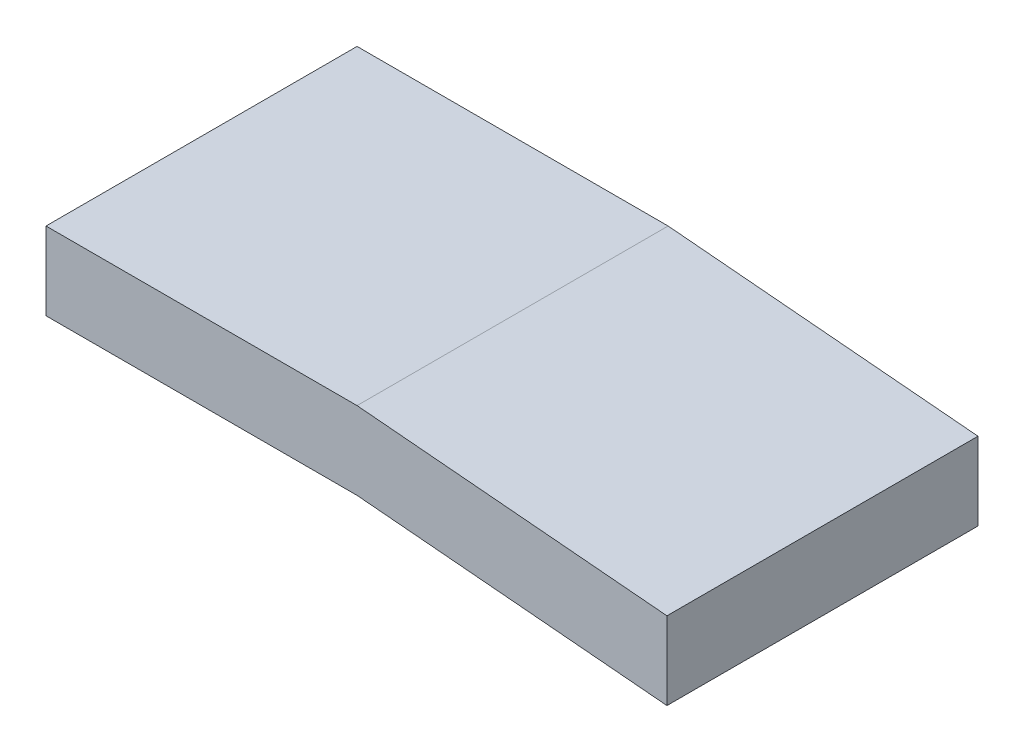
ISO-10303-21;
HEADER;
FILE_DESCRIPTION(('STEP AP214'),'2;1');
FILE_NAME('part.step','',(''),(''),'','','');
FILE_SCHEMA(('AUTOMOTIVE_DESIGN { 1 0 10303 214 1 1 1 1 }'));
ENDSEC;
DATA;
#1=APPLICATION_CONTEXT('core data for automotive mechanical design processes');
#2=APPLICATION_PROTOCOL_DEFINITION('international standard','automotive_design',2000,#1);
#3=PRODUCT_CONTEXT('',#1,'mechanical');
#4=PRODUCT('Part','Part','',(#3));
#5=PRODUCT_RELATED_PRODUCT_CATEGORY('part','',(#4));
#6=PRODUCT_DEFINITION_FORMATION('','',#4);
#7=PRODUCT_DEFINITION_CONTEXT('part definition',#1,'design');
#8=PRODUCT_DEFINITION('design','',#6,#7);
#9=PRODUCT_DEFINITION_SHAPE('','',#8);
#10=(LENGTH_UNIT() NAMED_UNIT(*) SI_UNIT(.MILLI.,.METRE.));
#11=(NAMED_UNIT(*) PLANE_ANGLE_UNIT() SI_UNIT($,.RADIAN.));
#12=(NAMED_UNIT(*) SI_UNIT($,.STERADIAN.) SOLID_ANGLE_UNIT());
#13=UNCERTAINTY_MEASURE_WITH_UNIT(LENGTH_MEASURE(1.E-05),#10,'distance_accuracy_value','');
#14=(GEOMETRIC_REPRESENTATION_CONTEXT(3) GLOBAL_UNCERTAINTY_ASSIGNED_CONTEXT((#13)) GLOBAL_UNIT_ASSIGNED_CONTEXT((#10,
#11,#12)) REPRESENTATION_CONTEXT('',''));
#15=CARTESIAN_POINT('',(0.,0.,0.));
#16=DIRECTION('',(0.,0.,1.));
#17=DIRECTION('',(1.,0.,0.));
#18=AXIS2_PLACEMENT_3D('',#15,#16,#17);
#19=CARTESIAN_POINT('',(50.8,0.,50.8));
#20=DIRECTION('',(0.,1.,0.));
#21=DIRECTION('',(-1.,0.,0.));
#22=AXIS2_PLACEMENT_3D('',#19,#20,#21);
#23=PLANE('',#22);
#24=DIRECTION('',(1.,0.,0.));
#25=VECTOR('',#24,1.);
#26=CARTESIAN_POINT('',(50.8,0.,0.));
#27=LINE('',#26,#25);
#28=CARTESIAN_POINT('',(0.,0.,0.));
#29=VERTEX_POINT('',#28);
#30=CARTESIAN_POINT('',(50.8,0.,0.));
#31=VERTEX_POINT('',#30);
#32=EDGE_CURVE('E120',#29,#31,#27,.T.);
#33=ORIENTED_EDGE('',*,*,#32,.T.);
#34=DIRECTION('',(0.,0.,-1.));
#35=VECTOR('',#34,1.);
#36=CARTESIAN_POINT('',(50.8,0.,50.8));
#37=LINE('',#36,#35);
#38=CARTESIAN_POINT('',(50.8,0.,50.8));
#39=VERTEX_POINT('',#38);
#40=EDGE_CURVE('E11',#39,#31,#37,.T.);
#41=ORIENTED_EDGE('',*,*,#40,.F.);
#42=DIRECTION('',(1.,0.,0.));
#43=VECTOR('',#42,1.);
#44=CARTESIAN_POINT('',(50.8,0.,50.8));
#45=LINE('',#44,#43);
#46=CARTESIAN_POINT('',(0.,0.,50.8));
#47=VERTEX_POINT('',#46);
#48=EDGE_CURVE('E130',#47,#39,#45,.T.);
#49=ORIENTED_EDGE('',*,*,#48,.F.);
#50=DIRECTION('',(0.,0.,-1.));
#51=VECTOR('',#50,1.);
#52=CARTESIAN_POINT('',(0.,0.,50.8));
#53=LINE('',#52,#51);
#54=EDGE_CURVE('E116',#47,#29,#53,.T.);
#55=ORIENTED_EDGE('',*,*,#54,.T.);
#56=EDGE_LOOP('',(#33,#41,#49,#55));
#57=FACE_BOUND('',#56,.T.);
#58=ADVANCED_FACE('F36',(#57),#23,.F.);
#59=CARTESIAN_POINT('',(101.406690663061,-4.42751173158105,50.8));
#60=DIRECTION('',(0.0871557427476582,0.996194698091746,0.));
#61=DIRECTION('',(-0.996194698091746,0.0871557427476582,0.));
#62=AXIS2_PLACEMENT_3D('',#59,#60,#61);
#63=PLANE('',#62);
#64=DIRECTION('',(0.996194698091746,-0.0871557427476582,0.));
#65=VECTOR('',#64,1.);
#66=CARTESIAN_POINT('',(101.406690663061,-4.42751173158105,0.));
#67=LINE('',#66,#65);
#68=CARTESIAN_POINT('',(101.406690663061,-4.42751173158105,0.));
#69=VERTEX_POINT('',#68);
#70=EDGE_CURVE('E123',#31,#69,#67,.T.);
#71=ORIENTED_EDGE('',*,*,#70,.T.);
#72=DIRECTION('',(0.,0.,-1.));
#73=VECTOR('',#72,1.);
#74=CARTESIAN_POINT('',(101.406690663061,-4.42751173158105,50.8));
#75=LINE('',#74,#73);
#76=CARTESIAN_POINT('',(101.406690663061,-4.42751173158105,50.8));
#77=VERTEX_POINT('',#76);
#78=EDGE_CURVE('E44',#77,#69,#75,.T.);
#79=ORIENTED_EDGE('',*,*,#78,.F.);
#80=DIRECTION('',(0.996194698091746,-0.0871557427476582,0.));
#81=VECTOR('',#80,1.);
#82=CARTESIAN_POINT('',(101.406690663061,-4.42751173158105,50.8));
#83=LINE('',#82,#81);
#84=EDGE_CURVE('E89',#39,#77,#83,.T.);
#85=ORIENTED_EDGE('',*,*,#84,.F.);
#86=ORIENTED_EDGE('',*,*,#40,.T.);
#87=EDGE_LOOP('',(#71,#79,#85,#86));
#88=FACE_BOUND('',#87,.T.);
#89=ADVANCED_FACE('F154',(#88),#63,.F.);
#90=CARTESIAN_POINT('',(101.406690663061,8.27248826841894,50.8));
#91=DIRECTION('',(-1.,0.,0.));
#92=DIRECTION('',(0.,-1.,0.));
#93=AXIS2_PLACEMENT_3D('',#90,#91,#92);
#94=PLANE('',#93);
#95=DIRECTION('',(0.,1.,0.));
#96=VECTOR('',#95,1.);
#97=CARTESIAN_POINT('',(101.406690663061,8.27248826841894,0.));
#98=LINE('',#97,#96);
#99=CARTESIAN_POINT('',(101.406690663061,8.27248826841894,0.));
#100=VERTEX_POINT('',#99);
#101=EDGE_CURVE('E125',#69,#100,#98,.T.);
#102=ORIENTED_EDGE('',*,*,#101,.T.);
#103=DIRECTION('',(0.,0.,-1.));
#104=VECTOR('',#103,1.);
#105=CARTESIAN_POINT('',(101.406690663061,8.27248826841894,50.8));
#106=LINE('',#105,#104);
#107=CARTESIAN_POINT('',(101.406690663061,8.27248826841894,50.8));
#108=VERTEX_POINT('',#107);
#109=EDGE_CURVE('E111',#108,#100,#106,.T.);
#110=ORIENTED_EDGE('',*,*,#109,.F.);
#111=DIRECTION('',(0.,1.,0.));
#112=VECTOR('',#111,1.);
#113=CARTESIAN_POINT('',(101.406690663061,8.27248826841894,50.8));
#114=LINE('',#113,#112);
#115=EDGE_CURVE('E102',#77,#108,#114,.T.);
#116=ORIENTED_EDGE('',*,*,#115,.F.);
#117=ORIENTED_EDGE('',*,*,#78,.T.);
#118=EDGE_LOOP('',(#102,#110,#116,#117));
#119=FACE_BOUND('',#118,.T.);
#120=ADVANCED_FACE('F136',(#119),#94,.F.);
#121=CARTESIAN_POINT('',(50.8,12.7,50.8));
#122=DIRECTION('',(-0.0871557427476586,-0.996194698091746,0.));
#123=DIRECTION('',(0.996194698091745,-0.0871557427476586,0.));
#124=AXIS2_PLACEMENT_3D('',#121,#122,#123);
#125=PLANE('',#124);
#126=DIRECTION('',(-0.996194698091745,0.0871557427476586,0.));
#127=VECTOR('',#126,1.);
#128=CARTESIAN_POINT('',(50.8,12.7,0.));
#129=LINE('',#128,#127);
#130=CARTESIAN_POINT('',(50.8,12.7,0.));
#131=VERTEX_POINT('',#130);
#132=EDGE_CURVE('E110',#100,#131,#129,.T.);
#133=ORIENTED_EDGE('',*,*,#132,.T.);
#134=DIRECTION('',(0.,0.,-1.));
#135=VECTOR('',#134,1.);
#136=CARTESIAN_POINT('',(50.8,12.7,50.8));
#137=LINE('',#136,#135);
#138=CARTESIAN_POINT('',(50.8,12.7,50.8));
#139=VERTEX_POINT('',#138);
#140=EDGE_CURVE('E107',#139,#131,#137,.T.);
#141=ORIENTED_EDGE('',*,*,#140,.F.);
#142=DIRECTION('',(-0.996194698091745,0.0871557427476586,0.));
#143=VECTOR('',#142,1.);
#144=CARTESIAN_POINT('',(50.8,12.7,50.8));
#145=LINE('',#144,#143);
#146=EDGE_CURVE('E96',#108,#139,#145,.T.);
#147=ORIENTED_EDGE('',*,*,#146,.F.);
#148=ORIENTED_EDGE('',*,*,#109,.T.);
#149=EDGE_LOOP('',(#133,#141,#147,#148));
#150=FACE_BOUND('',#149,.T.);
#151=ADVANCED_FACE('F108',(#150),#125,.F.);
#152=CARTESIAN_POINT('',(0.,12.7,50.8));
#153=DIRECTION('',(0.,-1.,0.));
#154=DIRECTION('',(0.,0.,-1.));
#155=AXIS2_PLACEMENT_3D('',#152,#153,#154);
#156=PLANE('',#155);
#157=DIRECTION('',(-1.,0.,0.));
#158=VECTOR('',#157,1.);
#159=CARTESIAN_POINT('',(0.,12.7,0.));
#160=LINE('',#159,#158);
#161=CARTESIAN_POINT('',(0.,12.7,0.));
#162=VERTEX_POINT('',#161);
#163=EDGE_CURVE('E75',#131,#162,#160,.T.);
#164=ORIENTED_EDGE('',*,*,#163,.T.);
#165=DIRECTION('',(0.,0.,-1.));
#166=VECTOR('',#165,1.);
#167=CARTESIAN_POINT('',(0.,12.7,50.8));
#168=LINE('',#167,#166);
#169=CARTESIAN_POINT('',(0.,12.7,50.8));
#170=VERTEX_POINT('',#169);
#171=EDGE_CURVE('E112',#170,#162,#168,.T.);
#172=ORIENTED_EDGE('',*,*,#171,.F.);
#173=DIRECTION('',(-1.,0.,0.));
#174=VECTOR('',#173,1.);
#175=CARTESIAN_POINT('',(0.,12.7,50.8));
#176=LINE('',#175,#174);
#177=EDGE_CURVE('E100',#139,#170,#176,.T.);
#178=ORIENTED_EDGE('',*,*,#177,.F.);
#179=ORIENTED_EDGE('',*,*,#140,.T.);
#180=EDGE_LOOP('',(#164,#172,#178,#179));
#181=FACE_BOUND('',#180,.T.);
#182=ADVANCED_FACE('F114',(#181),#156,.F.);
#183=CARTESIAN_POINT('',(0.,0.,50.8));
#184=DIRECTION('',(1.,0.,0.));
#185=DIRECTION('',(0.,0.,-1.));
#186=AXIS2_PLACEMENT_3D('',#183,#184,#185);
#187=PLANE('',#186);
#188=DIRECTION('',(0.,-1.,0.));
#189=VECTOR('',#188,1.);
#190=CARTESIAN_POINT('',(0.,0.,0.));
#191=LINE('',#190,#189);
#192=EDGE_CURVE('E81',#162,#29,#191,.T.);
#193=ORIENTED_EDGE('',*,*,#192,.T.);
#194=ORIENTED_EDGE('',*,*,#54,.F.);
#195=DIRECTION('',(0.,-1.,0.));
#196=VECTOR('',#195,1.);
#197=CARTESIAN_POINT('',(0.,0.,50.8));
#198=LINE('',#197,#196);
#199=EDGE_CURVE('E52',#170,#47,#198,.T.);
#200=ORIENTED_EDGE('',*,*,#199,.F.);
#201=ORIENTED_EDGE('',*,*,#171,.T.);
#202=EDGE_LOOP('',(#193,#194,#200,#201));
#203=FACE_BOUND('',#202,.T.);
#204=ADVANCED_FACE('F143',(#203),#187,.F.);
#205=CARTESIAN_POINT('',(0.,0.,50.8));
#206=DIRECTION('',(0.,0.,-1.));
#207=DIRECTION('',(-1.,0.,0.));
#208=AXIS2_PLACEMENT_3D('',#205,#206,#207);
#209=PLANE('',#208);
#210=ORIENTED_EDGE('',*,*,#48,.T.);
#211=ORIENTED_EDGE('',*,*,#84,.T.);
#212=ORIENTED_EDGE('',*,*,#115,.T.);
#213=ORIENTED_EDGE('',*,*,#146,.T.);
#214=ORIENTED_EDGE('',*,*,#177,.T.);
#215=ORIENTED_EDGE('',*,*,#199,.T.);
#216=EDGE_LOOP('',(#210,#211,#212,#213,#214,#215));
#217=FACE_BOUND('',#216,.T.);
#218=ADVANCED_FACE('F98',(#217),#209,.F.);
#219=CARTESIAN_POINT('',(0.,0.,0.));
#220=DIRECTION('',(0.,0.,-1.));
#221=DIRECTION('',(-1.,0.,0.));
#222=AXIS2_PLACEMENT_3D('',#219,#220,#221);
#223=PLANE('',#222);
#224=ORIENTED_EDGE('',*,*,#32,.F.);
#225=ORIENTED_EDGE('',*,*,#192,.F.);
#226=ORIENTED_EDGE('',*,*,#163,.F.);
#227=ORIENTED_EDGE('',*,*,#132,.F.);
#228=ORIENTED_EDGE('',*,*,#101,.F.);
#229=ORIENTED_EDGE('',*,*,#70,.F.);
#230=EDGE_LOOP('',(#224,#225,#226,#227,#228,#229));
#231=FACE_BOUND('',#230,.T.);
#232=ADVANCED_FACE('F139',(#231),#223,.T.);
#233=CLOSED_SHELL('',(#58,#89,#120,#151,#182,#204,#218,#232));
#234=MANIFOLD_SOLID_BREP('B2',#233);
#235=ADVANCED_BREP_SHAPE_REPRESENTATION('',(#18,#234),#14);
#236=SHAPE_DEFINITION_REPRESENTATION(#9,#235);
ENDSEC;
END-ISO-10303-21;
